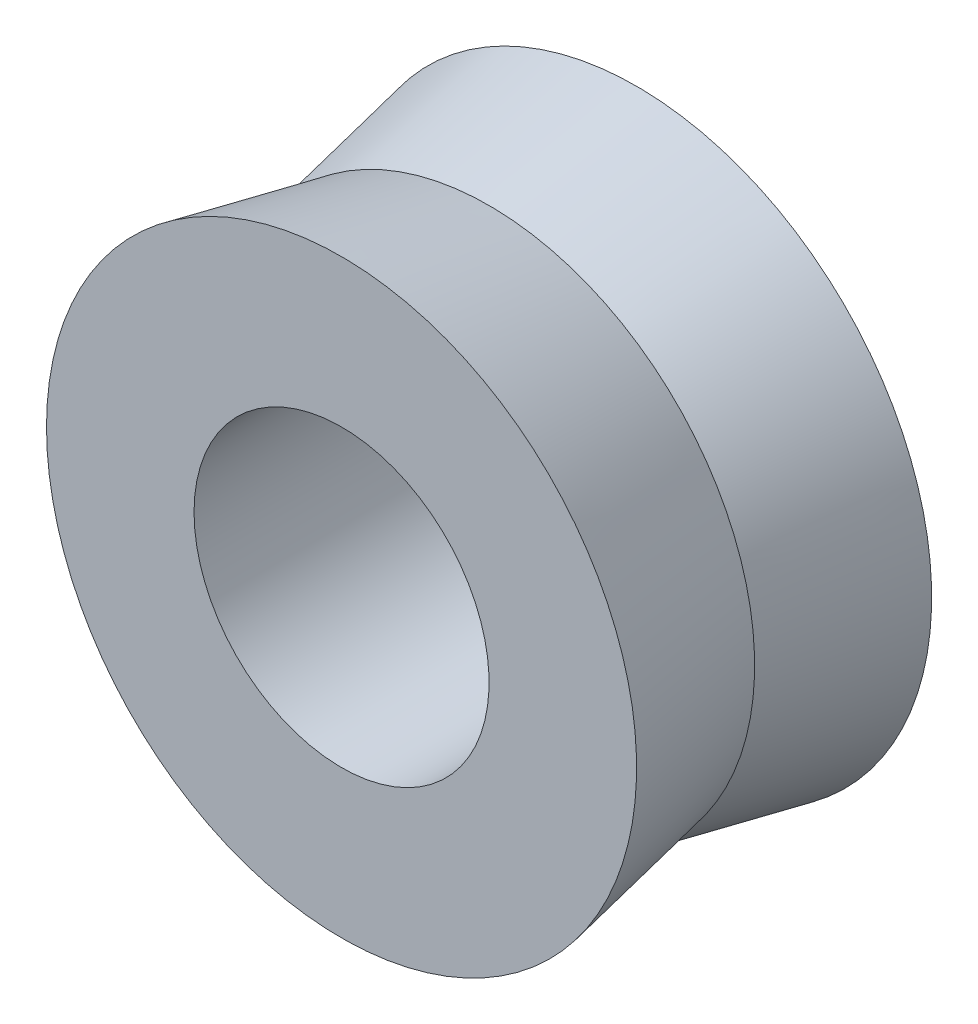
ISO-10303-21;
HEADER;
FILE_DESCRIPTION(('STEP AP214'),'2;1');
FILE_NAME('part.step','',(''),(''),'','','');
FILE_SCHEMA(('AUTOMOTIVE_DESIGN { 1 0 10303 214 1 1 1 1 }'));
ENDSEC;
DATA;
#1=APPLICATION_CONTEXT('core data for automotive mechanical design processes');
#2=APPLICATION_PROTOCOL_DEFINITION('international standard','automotive_design',2000,#1);
#3=PRODUCT_CONTEXT('',#1,'mechanical');
#4=PRODUCT('Part','Part','',(#3));
#5=PRODUCT_RELATED_PRODUCT_CATEGORY('part','',(#4));
#6=PRODUCT_DEFINITION_FORMATION('','',#4);
#7=PRODUCT_DEFINITION_CONTEXT('part definition',#1,'design');
#8=PRODUCT_DEFINITION('design','',#6,#7);
#9=PRODUCT_DEFINITION_SHAPE('','',#8);
#10=(LENGTH_UNIT() NAMED_UNIT(*) SI_UNIT(.MILLI.,.METRE.));
#11=(NAMED_UNIT(*) PLANE_ANGLE_UNIT() SI_UNIT($,.RADIAN.));
#12=(NAMED_UNIT(*) SI_UNIT($,.STERADIAN.) SOLID_ANGLE_UNIT());
#13=UNCERTAINTY_MEASURE_WITH_UNIT(LENGTH_MEASURE(1.E-05),#10,'distance_accuracy_value','');
#14=(GEOMETRIC_REPRESENTATION_CONTEXT(3) GLOBAL_UNCERTAINTY_ASSIGNED_CONTEXT((#13)) GLOBAL_UNIT_ASSIGNED_CONTEXT((#10,
#11,#12)) REPRESENTATION_CONTEXT('',''));
#15=CARTESIAN_POINT('',(0.,0.,0.));
#16=DIRECTION('',(0.,0.,1.));
#17=DIRECTION('',(1.,0.,0.));
#18=AXIS2_PLACEMENT_3D('',#15,#16,#17);
#19=CARTESIAN_POINT('',(0.,0.,-12.7));
#20=DIRECTION('',(0.,0.,-1.));
#21=DIRECTION('',(-1.,0.,0.));
#22=AXIS2_PLACEMENT_3D('',#19,#20,#21);
#23=CYLINDRICAL_SURFACE('',#22,6.35);
#24=CARTESIAN_POINT('',(0.,0.,0.));
#25=DIRECTION('',(0.,0.,-1.));
#26=DIRECTION('',(-1.,0.,0.));
#27=AXIS2_PLACEMENT_3D('',#24,#25,#26);
#28=CIRCLE('',#27,6.35);
#29=CARTESIAN_POINT('',(-6.35,0.,0.));
#30=VERTEX_POINT('',#29);
#31=EDGE_CURVE('E52',#30,#30,#28,.T.);
#32=ORIENTED_EDGE('',*,*,#31,.F.);
#33=EDGE_LOOP('',(#32));
#34=FACE_BOUND('',#33,.T.);
#35=CARTESIAN_POINT('',(0.,0.,-12.7));
#36=DIRECTION('',(0.,0.,-1.));
#37=DIRECTION('',(-1.,0.,0.));
#38=AXIS2_PLACEMENT_3D('',#35,#36,#37);
#39=CIRCLE('',#38,6.35);
#40=CARTESIAN_POINT('',(-6.35,0.,-12.7));
#41=VERTEX_POINT('',#40);
#42=EDGE_CURVE('E10',#41,#41,#39,.T.);
#43=ORIENTED_EDGE('',*,*,#42,.T.);
#44=EDGE_LOOP('',(#43));
#45=FACE_BOUND('',#44,.T.);
#46=ADVANCED_FACE('F33',(#34,#45),#23,.F.);
#47=CARTESIAN_POINT('',(0.,0.,-12.7));
#48=DIRECTION('',(0.,0.,1.));
#49=DIRECTION('',(1.,0.,0.));
#50=AXIS2_PLACEMENT_3D('',#47,#48,#49);
#51=PLANE('',#50);
#52=ORIENTED_EDGE('',*,*,#42,.F.);
#53=EDGE_LOOP('',(#52));
#54=FACE_BOUND('',#53,.T.);
#55=CARTESIAN_POINT('',(0.,0.,-12.7));
#56=DIRECTION('',(0.,0.,-1.));
#57=DIRECTION('',(-1.,0.,0.));
#58=AXIS2_PLACEMENT_3D('',#55,#56,#57);
#59=CIRCLE('',#58,12.7);
#60=CARTESIAN_POINT('',(-12.7,0.,-12.7));
#61=VERTEX_POINT('',#60);
#62=EDGE_CURVE('E39',#61,#61,#59,.T.);
#63=ORIENTED_EDGE('',*,*,#62,.T.);
#64=EDGE_LOOP('',(#63));
#65=FACE_BOUND('',#64,.T.);
#66=ADVANCED_FACE('F59',(#54,#65),#51,.F.);
#67=CARTESIAN_POINT('',(0.,0.,-12.7));
#68=DIRECTION('',(0.,0.,-1.));
#69=DIRECTION('',(-1.,0.,0.));
#70=AXIS2_PLACEMENT_3D('',#67,#68,#69);
#71=CONICAL_SURFACE('',#70,12.7,0.197395559849881);
#72=CARTESIAN_POINT('',(0.,0.,-6.35));
#73=DIRECTION('',(0.,0.,-1.));
#74=DIRECTION('',(-1.,0.,0.));
#75=AXIS2_PLACEMENT_3D('',#72,#73,#74);
#76=CIRCLE('',#75,11.43);
#77=CARTESIAN_POINT('',(-11.43,0.,-6.35));
#78=VERTEX_POINT('',#77);
#79=EDGE_CURVE('E43',#78,#78,#76,.T.);
#80=ORIENTED_EDGE('',*,*,#79,.T.);
#81=EDGE_LOOP('',(#80));
#82=FACE_BOUND('',#81,.T.);
#83=ORIENTED_EDGE('',*,*,#62,.F.);
#84=EDGE_LOOP('',(#83));
#85=FACE_BOUND('',#84,.T.);
#86=ADVANCED_FACE('F63',(#82,#85),#71,.T.);
#87=CARTESIAN_POINT('',(0.,0.,-6.35));
#88=DIRECTION('',(0.,0.,1.));
#89=DIRECTION('',(1.,0.,0.));
#90=AXIS2_PLACEMENT_3D('',#87,#88,#89);
#91=CONICAL_SURFACE('',#90,11.43,0.197395559849881);
#92=CARTESIAN_POINT('',(0.,0.,0.));
#93=DIRECTION('',(0.,0.,-1.));
#94=DIRECTION('',(-1.,0.,0.));
#95=AXIS2_PLACEMENT_3D('',#92,#93,#94);
#96=CIRCLE('',#95,12.7);
#97=CARTESIAN_POINT('',(-12.7,0.,0.));
#98=VERTEX_POINT('',#97);
#99=EDGE_CURVE('E47',#98,#98,#96,.T.);
#100=ORIENTED_EDGE('',*,*,#99,.T.);
#101=EDGE_LOOP('',(#100));
#102=FACE_BOUND('',#101,.T.);
#103=ORIENTED_EDGE('',*,*,#79,.F.);
#104=EDGE_LOOP('',(#103));
#105=FACE_BOUND('',#104,.T.);
#106=ADVANCED_FACE('F68',(#102,#105),#91,.T.);
#107=CARTESIAN_POINT('',(0.,0.,0.));
#108=DIRECTION('',(0.,0.,-1.));
#109=DIRECTION('',(-1.,0.,0.));
#110=AXIS2_PLACEMENT_3D('',#107,#108,#109);
#111=PLANE('',#110);
#112=ORIENTED_EDGE('',*,*,#99,.F.);
#113=EDGE_LOOP('',(#112));
#114=FACE_BOUND('',#113,.T.);
#115=ORIENTED_EDGE('',*,*,#31,.T.);
#116=EDGE_LOOP('',(#115));
#117=FACE_BOUND('',#116,.T.);
#118=ADVANCED_FACE('F56',(#114,#117),#111,.F.);
#119=CLOSED_SHELL('',(#46,#66,#86,#106,#118));
#120=MANIFOLD_SOLID_BREP('B2',#119);
#121=ADVANCED_BREP_SHAPE_REPRESENTATION('',(#18,#120),#14);
#122=SHAPE_DEFINITION_REPRESENTATION(#9,#121);
ENDSEC;
END-ISO-10303-21;
